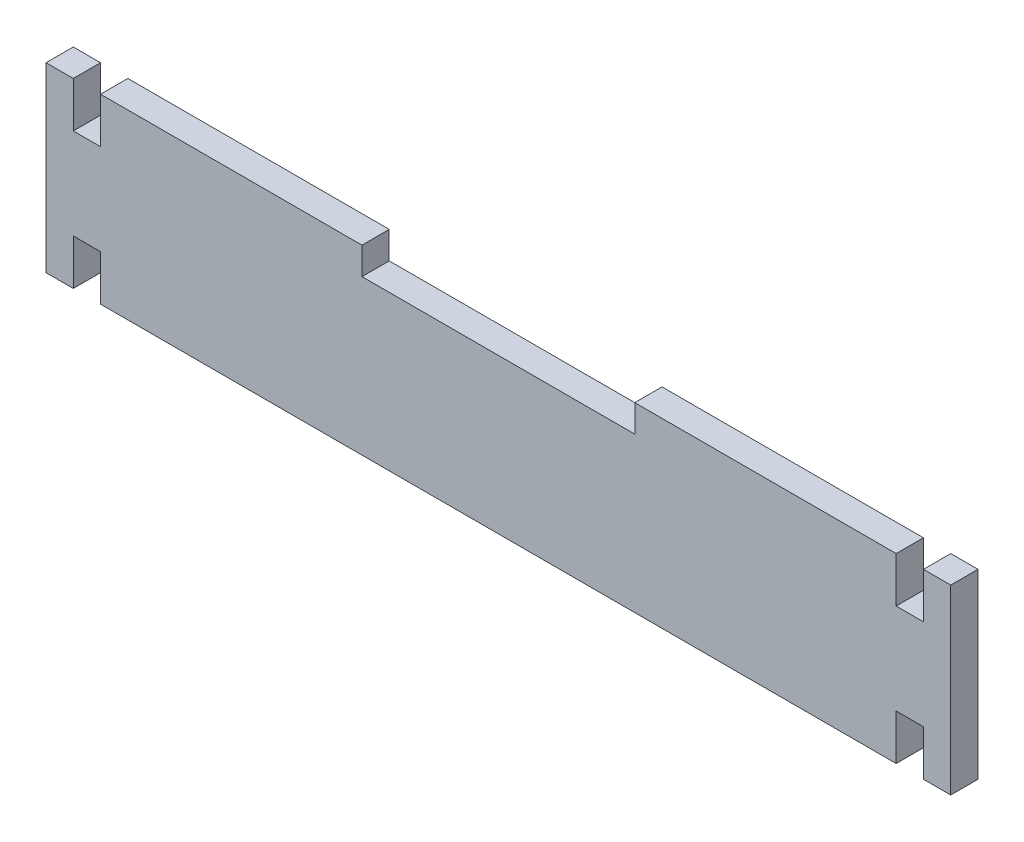
ISO-10303-21;
HEADER;
FILE_DESCRIPTION(('STEP AP214'),'2;1');
FILE_NAME('part.step','',(''),(''),'','','');
FILE_SCHEMA(('AUTOMOTIVE_DESIGN { 1 0 10303 214 1 1 1 1 }'));
ENDSEC;
DATA;
#1=APPLICATION_CONTEXT('core data for automotive mechanical design processes');
#2=APPLICATION_PROTOCOL_DEFINITION('international standard','automotive_design',2000,#1);
#3=PRODUCT_CONTEXT('',#1,'mechanical');
#4=PRODUCT('Part','Part','',(#3));
#5=PRODUCT_RELATED_PRODUCT_CATEGORY('part','',(#4));
#6=PRODUCT_DEFINITION_FORMATION('','',#4);
#7=PRODUCT_DEFINITION_CONTEXT('part definition',#1,'design');
#8=PRODUCT_DEFINITION('design','',#6,#7);
#9=PRODUCT_DEFINITION_SHAPE('','',#8);
#10=(LENGTH_UNIT() NAMED_UNIT(*) SI_UNIT(.MILLI.,.METRE.));
#11=(NAMED_UNIT(*) PLANE_ANGLE_UNIT() SI_UNIT($,.RADIAN.));
#12=(NAMED_UNIT(*) SI_UNIT($,.STERADIAN.) SOLID_ANGLE_UNIT());
#13=UNCERTAINTY_MEASURE_WITH_UNIT(LENGTH_MEASURE(1.E-05),#10,'distance_accuracy_value','');
#14=(GEOMETRIC_REPRESENTATION_CONTEXT(3) GLOBAL_UNCERTAINTY_ASSIGNED_CONTEXT((#13)) GLOBAL_UNIT_ASSIGNED_CONTEXT((#10,
#11,#12)) REPRESENTATION_CONTEXT('',''));
#15=CARTESIAN_POINT('',(0.,0.,0.));
#16=DIRECTION('',(0.,0.,1.));
#17=DIRECTION('',(1.,0.,0.));
#18=AXIS2_PLACEMENT_3D('',#15,#16,#17);
#19=CARTESIAN_POINT('',(0.,40.,6.));
#20=DIRECTION('',(0.,-1.,0.));
#21=DIRECTION('',(1.,0.,0.));
#22=AXIS2_PLACEMENT_3D('',#19,#20,#21);
#23=PLANE('',#22);
#24=DIRECTION('',(-1.,0.,0.));
#25=VECTOR('',#24,1.);
#26=CARTESIAN_POINT('',(0.,40.,6.));
#27=LINE('',#26,#25);
#28=CARTESIAN_POINT('',(-129.5,40.,6.));
#29=VERTEX_POINT('',#28);
#30=CARTESIAN_POINT('',(-187.,40.,6.));
#31=VERTEX_POINT('',#30);
#32=EDGE_CURVE('E406',#29,#31,#27,.T.);
#33=ORIENTED_EDGE('',*,*,#32,.F.);
#34=DIRECTION('',(0.,0.,1.));
#35=VECTOR('',#34,1.);
#36=CARTESIAN_POINT('',(-129.5,40.,0.));
#37=LINE('',#36,#35);
#38=CARTESIAN_POINT('',(-129.5,40.,0.));
#39=VERTEX_POINT('',#38);
#40=EDGE_CURVE('E242',#39,#29,#37,.T.);
#41=ORIENTED_EDGE('',*,*,#40,.F.);
#42=DIRECTION('',(-1.,0.,0.));
#43=VECTOR('',#42,1.);
#44=CARTESIAN_POINT('',(0.,40.,0.));
#45=LINE('',#44,#43);
#46=CARTESIAN_POINT('',(-187.,40.,0.));
#47=VERTEX_POINT('',#46);
#48=EDGE_CURVE('E228',#39,#47,#45,.T.);
#49=ORIENTED_EDGE('',*,*,#48,.T.);
#50=DIRECTION('',(0.,0.,1.));
#51=VECTOR('',#50,1.);
#52=CARTESIAN_POINT('',(-187.,40.,0.));
#53=LINE('',#52,#51);
#54=EDGE_CURVE('E385',#47,#31,#53,.T.);
#55=ORIENTED_EDGE('',*,*,#54,.T.);
#56=EDGE_LOOP('',(#33,#41,#49,#55));
#57=FACE_BOUND('',#56,.T.);
#58=ADVANCED_FACE('F44',(#57),#23,.F.);
#59=CARTESIAN_POINT('',(-12.,40.,0.));
#60=VERTEX_POINT('',#59);
#61=CARTESIAN_POINT('',(-69.5,40.,0.));
#62=VERTEX_POINT('',#61);
#63=EDGE_CURVE('E425',#60,#62,#45,.T.);
#64=ORIENTED_EDGE('',*,*,#63,.T.);
#65=DIRECTION('',(0.,0.,1.));
#66=VECTOR('',#65,1.);
#67=CARTESIAN_POINT('',(-69.5,40.,0.));
#68=LINE('',#67,#66);
#69=CARTESIAN_POINT('',(-69.5,40.,6.));
#70=VERTEX_POINT('',#69);
#71=EDGE_CURVE('E246',#62,#70,#68,.T.);
#72=ORIENTED_EDGE('',*,*,#71,.T.);
#73=CARTESIAN_POINT('',(-12.,40.,6.));
#74=VERTEX_POINT('',#73);
#75=EDGE_CURVE('E405',#74,#70,#27,.T.);
#76=ORIENTED_EDGE('',*,*,#75,.F.);
#77=DIRECTION('',(0.,0.,1.));
#78=VECTOR('',#77,1.);
#79=CARTESIAN_POINT('',(-12.,40.,0.));
#80=LINE('',#79,#78);
#81=EDGE_CURVE('E268',#60,#74,#80,.T.);
#82=ORIENTED_EDGE('',*,*,#81,.F.);
#83=EDGE_LOOP('',(#64,#72,#76,#82));
#84=FACE_BOUND('',#83,.T.);
#85=ADVANCED_FACE('F473',(#84),#23,.F.);
#86=CARTESIAN_POINT('',(0.,0.,6.));
#87=DIRECTION('',(0.,1.,0.));
#88=DIRECTION('',(-1.,0.,0.));
#89=AXIS2_PLACEMENT_3D('',#86,#87,#88);
#90=PLANE('',#89);
#91=DIRECTION('',(1.,0.,0.));
#92=VECTOR('',#91,1.);
#93=CARTESIAN_POINT('',(0.,0.,0.));
#94=LINE('',#93,#92);
#95=CARTESIAN_POINT('',(-199.,0.,0.));
#96=VERTEX_POINT('',#95);
#97=CARTESIAN_POINT('',(-193.,0.,0.));
#98=VERTEX_POINT('',#97);
#99=EDGE_CURVE('E399',#96,#98,#94,.T.);
#100=ORIENTED_EDGE('',*,*,#99,.T.);
#101=DIRECTION('',(0.,0.,1.));
#102=VECTOR('',#101,1.);
#103=CARTESIAN_POINT('',(-193.,0.,0.));
#104=LINE('',#103,#102);
#105=CARTESIAN_POINT('',(-193.,0.,6.));
#106=VERTEX_POINT('',#105);
#107=EDGE_CURVE('E263',#98,#106,#104,.T.);
#108=ORIENTED_EDGE('',*,*,#107,.T.);
#109=DIRECTION('',(1.,0.,0.));
#110=VECTOR('',#109,1.);
#111=CARTESIAN_POINT('',(0.,0.,6.));
#112=LINE('',#111,#110);
#113=CARTESIAN_POINT('',(-199.,0.,6.));
#114=VERTEX_POINT('',#113);
#115=EDGE_CURVE('E410',#114,#106,#112,.T.);
#116=ORIENTED_EDGE('',*,*,#115,.F.);
#117=DIRECTION('',(0.,0.,-1.));
#118=VECTOR('',#117,1.);
#119=CARTESIAN_POINT('',(-199.,0.,6.));
#120=LINE('',#119,#118);
#121=EDGE_CURVE('E436',#114,#96,#120,.T.);
#122=ORIENTED_EDGE('',*,*,#121,.T.);
#123=EDGE_LOOP('',(#100,#108,#116,#122));
#124=FACE_BOUND('',#123,.T.);
#125=ADVANCED_FACE('F453',(#124),#90,.F.);
#126=CARTESIAN_POINT('',(-187.,0.,6.));
#127=VERTEX_POINT('',#126);
#128=CARTESIAN_POINT('',(-12.,0.,6.));
#129=VERTEX_POINT('',#128);
#130=EDGE_CURVE('E415',#127,#129,#112,.T.);
#131=ORIENTED_EDGE('',*,*,#130,.F.);
#132=DIRECTION('',(0.,0.,1.));
#133=VECTOR('',#132,1.);
#134=CARTESIAN_POINT('',(-187.,0.,0.));
#135=LINE('',#134,#133);
#136=CARTESIAN_POINT('',(-187.,0.,0.));
#137=VERTEX_POINT('',#136);
#138=EDGE_CURVE('E282',#137,#127,#135,.T.);
#139=ORIENTED_EDGE('',*,*,#138,.F.);
#140=CARTESIAN_POINT('',(-12.,0.,0.));
#141=VERTEX_POINT('',#140);
#142=EDGE_CURVE('E432',#137,#141,#94,.T.);
#143=ORIENTED_EDGE('',*,*,#142,.T.);
#144=DIRECTION('',(0.,0.,1.));
#145=VECTOR('',#144,1.);
#146=CARTESIAN_POINT('',(-12.,0.,0.));
#147=LINE('',#146,#145);
#148=EDGE_CURVE('E337',#141,#129,#147,.T.);
#149=ORIENTED_EDGE('',*,*,#148,.T.);
#150=EDGE_LOOP('',(#131,#139,#143,#149));
#151=FACE_BOUND('',#150,.T.);
#152=ADVANCED_FACE('F510',(#151),#90,.F.);
#153=CARTESIAN_POINT('',(-193.,40.,6.));
#154=VERTEX_POINT('',#153);
#155=CARTESIAN_POINT('',(-199.,40.,6.));
#156=VERTEX_POINT('',#155);
#157=EDGE_CURVE('E398',#154,#156,#27,.T.);
#158=ORIENTED_EDGE('',*,*,#157,.F.);
#159=DIRECTION('',(0.,0.,1.));
#160=VECTOR('',#159,1.);
#161=CARTESIAN_POINT('',(-193.,40.,0.));
#162=LINE('',#161,#160);
#163=CARTESIAN_POINT('',(-193.,40.,0.));
#164=VERTEX_POINT('',#163);
#165=EDGE_CURVE('E381',#164,#154,#162,.T.);
#166=ORIENTED_EDGE('',*,*,#165,.F.);
#167=CARTESIAN_POINT('',(-199.,40.,0.));
#168=VERTEX_POINT('',#167);
#169=EDGE_CURVE('E419',#164,#168,#45,.T.);
#170=ORIENTED_EDGE('',*,*,#169,.T.);
#171=DIRECTION('',(0.,0.,-1.));
#172=VECTOR('',#171,1.);
#173=CARTESIAN_POINT('',(-199.,40.,6.));
#174=LINE('',#173,#172);
#175=EDGE_CURVE('E53',#156,#168,#174,.T.);
#176=ORIENTED_EDGE('',*,*,#175,.F.);
#177=EDGE_LOOP('',(#158,#166,#170,#176));
#178=FACE_BOUND('',#177,.T.);
#179=ADVANCED_FACE('F479',(#178),#23,.F.);
#180=CARTESIAN_POINT('',(0.,0.,6.));
#181=DIRECTION('',(-1.,0.,0.));
#182=DIRECTION('',(0.,0.,1.));
#183=AXIS2_PLACEMENT_3D('',#180,#181,#182);
#184=PLANE('',#183);
#185=DIRECTION('',(0.,1.,0.));
#186=VECTOR('',#185,1.);
#187=CARTESIAN_POINT('',(0.,0.,0.));
#188=LINE('',#187,#186);
#189=CARTESIAN_POINT('',(0.,0.,0.));
#190=VERTEX_POINT('',#189);
#191=CARTESIAN_POINT('',(0.,40.,0.));
#192=VERTEX_POINT('',#191);
#193=EDGE_CURVE('E384',#190,#192,#188,.T.);
#194=ORIENTED_EDGE('',*,*,#193,.T.);
#195=DIRECTION('',(0.,0.,-1.));
#196=VECTOR('',#195,1.);
#197=CARTESIAN_POINT('',(0.,40.,6.));
#198=LINE('',#197,#196);
#199=CARTESIAN_POINT('',(0.,40.,6.));
#200=VERTEX_POINT('',#199);
#201=EDGE_CURVE('E11',#200,#192,#198,.T.);
#202=ORIENTED_EDGE('',*,*,#201,.F.);
#203=DIRECTION('',(0.,1.,0.));
#204=VECTOR('',#203,1.);
#205=CARTESIAN_POINT('',(0.,0.,6.));
#206=LINE('',#205,#204);
#207=CARTESIAN_POINT('',(0.,0.,6.));
#208=VERTEX_POINT('',#207);
#209=EDGE_CURVE('E394',#208,#200,#206,.T.);
#210=ORIENTED_EDGE('',*,*,#209,.F.);
#211=DIRECTION('',(0.,0.,-1.));
#212=VECTOR('',#211,1.);
#213=CARTESIAN_POINT('',(0.,0.,6.));
#214=LINE('',#213,#212);
#215=EDGE_CURVE('E414',#208,#190,#214,.T.);
#216=ORIENTED_EDGE('',*,*,#215,.T.);
#217=EDGE_LOOP('',(#194,#202,#210,#216));
#218=FACE_BOUND('',#217,.T.);
#219=ADVANCED_FACE('F46',(#218),#184,.F.);
#220=CARTESIAN_POINT('',(-6.00000000000001,40.,0.));
#221=VERTEX_POINT('',#220);
#222=EDGE_CURVE('E420',#192,#221,#45,.T.);
#223=ORIENTED_EDGE('',*,*,#222,.T.);
#224=DIRECTION('',(0.,0.,1.));
#225=VECTOR('',#224,1.);
#226=CARTESIAN_POINT('',(-6.00000000000001,40.,0.));
#227=LINE('',#226,#225);
#228=CARTESIAN_POINT('',(-6.00000000000001,40.,6.));
#229=VERTEX_POINT('',#228);
#230=EDGE_CURVE('E315',#221,#229,#227,.T.);
#231=ORIENTED_EDGE('',*,*,#230,.T.);
#232=EDGE_CURVE('E400',#200,#229,#27,.T.);
#233=ORIENTED_EDGE('',*,*,#232,.F.);
#234=ORIENTED_EDGE('',*,*,#201,.T.);
#235=EDGE_LOOP('',(#223,#231,#233,#234));
#236=FACE_BOUND('',#235,.T.);
#237=ADVANCED_FACE('F493',(#236),#23,.F.);
#238=CARTESIAN_POINT('',(-199.,0.,6.));
#239=DIRECTION('',(1.,0.,0.));
#240=DIRECTION('',(0.,0.,-1.));
#241=AXIS2_PLACEMENT_3D('',#238,#239,#240);
#242=PLANE('',#241);
#243=DIRECTION('',(0.,-1.,0.));
#244=VECTOR('',#243,1.);
#245=CARTESIAN_POINT('',(-199.,0.,0.));
#246=LINE('',#245,#244);
#247=EDGE_CURVE('E424',#168,#96,#246,.T.);
#248=ORIENTED_EDGE('',*,*,#247,.T.);
#249=ORIENTED_EDGE('',*,*,#121,.F.);
#250=DIRECTION('',(0.,-1.,0.));
#251=VECTOR('',#250,1.);
#252=CARTESIAN_POINT('',(-199.,0.,6.));
#253=LINE('',#252,#251);
#254=EDGE_CURVE('E404',#156,#114,#253,.T.);
#255=ORIENTED_EDGE('',*,*,#254,.F.);
#256=ORIENTED_EDGE('',*,*,#175,.T.);
#257=EDGE_LOOP('',(#248,#249,#255,#256));
#258=FACE_BOUND('',#257,.T.);
#259=ADVANCED_FACE('F445',(#258),#242,.F.);
#260=CARTESIAN_POINT('',(-6.00000000000001,0.,6.));
#261=VERTEX_POINT('',#260);
#262=EDGE_CURVE('E409',#261,#208,#112,.T.);
#263=ORIENTED_EDGE('',*,*,#262,.F.);
#264=DIRECTION('',(0.,0.,1.));
#265=VECTOR('',#264,1.);
#266=CARTESIAN_POINT('',(-6.00000000000001,0.,0.));
#267=LINE('',#266,#265);
#268=CARTESIAN_POINT('',(-6.00000000000001,0.,0.));
#269=VERTEX_POINT('',#268);
#270=EDGE_CURVE('E352',#269,#261,#267,.T.);
#271=ORIENTED_EDGE('',*,*,#270,.F.);
#272=EDGE_CURVE('E428',#269,#190,#94,.T.);
#273=ORIENTED_EDGE('',*,*,#272,.T.);
#274=ORIENTED_EDGE('',*,*,#215,.F.);
#275=EDGE_LOOP('',(#263,#271,#273,#274));
#276=FACE_BOUND('',#275,.T.);
#277=ADVANCED_FACE('F506',(#276),#90,.F.);
#278=CARTESIAN_POINT('',(0.,0.,6.));
#279=DIRECTION('',(0.,0.,1.));
#280=DIRECTION('',(1.,0.,0.));
#281=AXIS2_PLACEMENT_3D('',#278,#279,#280);
#282=PLANE('',#281);
#283=DIRECTION('',(0.,-1.,0.));
#284=VECTOR('',#283,1.);
#285=CARTESIAN_POINT('',(-129.5,40.,6.));
#286=LINE('',#285,#284);
#287=CARTESIAN_POINT('',(-129.5,34.,6.));
#288=VERTEX_POINT('',#287);
#289=EDGE_CURVE('E212',#29,#288,#286,.T.);
#290=ORIENTED_EDGE('',*,*,#289,.F.);
#291=ORIENTED_EDGE('',*,*,#32,.T.);
#292=DIRECTION('',(0.,1.,0.));
#293=VECTOR('',#292,1.);
#294=CARTESIAN_POINT('',(-187.,40.,6.));
#295=LINE('',#294,#293);
#296=CARTESIAN_POINT('',(-187.,30.,6.));
#297=VERTEX_POINT('',#296);
#298=EDGE_CURVE('E363',#297,#31,#295,.T.);
#299=ORIENTED_EDGE('',*,*,#298,.F.);
#300=DIRECTION('',(1.,0.,0.));
#301=VECTOR('',#300,1.);
#302=CARTESIAN_POINT('',(-193.,30.,6.));
#303=LINE('',#302,#301);
#304=CARTESIAN_POINT('',(-193.,30.,6.));
#305=VERTEX_POINT('',#304);
#306=EDGE_CURVE('E374',#305,#297,#303,.T.);
#307=ORIENTED_EDGE('',*,*,#306,.F.);
#308=DIRECTION('',(0.,-1.,0.));
#309=VECTOR('',#308,1.);
#310=CARTESIAN_POINT('',(-193.,40.,6.));
#311=LINE('',#310,#309);
#312=EDGE_CURVE('E278',#154,#305,#311,.T.);
#313=ORIENTED_EDGE('',*,*,#312,.F.);
#314=ORIENTED_EDGE('',*,*,#157,.T.);
#315=ORIENTED_EDGE('',*,*,#254,.T.);
#316=ORIENTED_EDGE('',*,*,#115,.T.);
#317=DIRECTION('',(0.,-1.,0.));
#318=VECTOR('',#317,1.);
#319=CARTESIAN_POINT('',(-193.,10.,6.));
#320=LINE('',#319,#318);
#321=CARTESIAN_POINT('',(-193.,10.,6.));
#322=VERTEX_POINT('',#321);
#323=EDGE_CURVE('E264',#322,#106,#320,.T.);
#324=ORIENTED_EDGE('',*,*,#323,.F.);
#325=DIRECTION('',(-1.,0.,0.));
#326=VECTOR('',#325,1.);
#327=CARTESIAN_POINT('',(-193.,10.,6.));
#328=LINE('',#327,#326);
#329=CARTESIAN_POINT('',(-187.,10.,6.));
#330=VERTEX_POINT('',#329);
#331=EDGE_CURVE('E257',#330,#322,#328,.T.);
#332=ORIENTED_EDGE('',*,*,#331,.F.);
#333=DIRECTION('',(0.,1.,0.));
#334=VECTOR('',#333,1.);
#335=CARTESIAN_POINT('',(-187.,10.,6.));
#336=LINE('',#335,#334);
#337=EDGE_CURVE('E267',#127,#330,#336,.T.);
#338=ORIENTED_EDGE('',*,*,#337,.F.);
#339=ORIENTED_EDGE('',*,*,#130,.T.);
#340=DIRECTION('',(0.,-1.,0.));
#341=VECTOR('',#340,1.);
#342=CARTESIAN_POINT('',(-12.,10.,6.));
#343=LINE('',#342,#341);
#344=CARTESIAN_POINT('',(-12.,10.,6.));
#345=VERTEX_POINT('',#344);
#346=EDGE_CURVE('E245',#345,#129,#343,.T.);
#347=ORIENTED_EDGE('',*,*,#346,.F.);
#348=DIRECTION('',(-1.,0.,0.));
#349=VECTOR('',#348,1.);
#350=CARTESIAN_POINT('',(-12.,10.,6.));
#351=LINE('',#350,#349);
#352=CARTESIAN_POINT('',(-6.00000000000001,10.,6.));
#353=VERTEX_POINT('',#352);
#354=EDGE_CURVE('E329',#353,#345,#351,.T.);
#355=ORIENTED_EDGE('',*,*,#354,.F.);
#356=DIRECTION('',(0.,1.,0.));
#357=VECTOR('',#356,1.);
#358=CARTESIAN_POINT('',(-6.00000000000001,10.,6.));
#359=LINE('',#358,#357);
#360=EDGE_CURVE('E340',#261,#353,#359,.T.);
#361=ORIENTED_EDGE('',*,*,#360,.F.);
#362=ORIENTED_EDGE('',*,*,#262,.T.);
#363=ORIENTED_EDGE('',*,*,#209,.T.);
#364=ORIENTED_EDGE('',*,*,#232,.T.);
#365=DIRECTION('',(0.,1.,0.));
#366=VECTOR('',#365,1.);
#367=CARTESIAN_POINT('',(-6.00000000000001,40.,6.));
#368=LINE('',#367,#366);
#369=CARTESIAN_POINT('',(-6.00000000000001,30.,6.));
#370=VERTEX_POINT('',#369);
#371=EDGE_CURVE('E293',#370,#229,#368,.T.);
#372=ORIENTED_EDGE('',*,*,#371,.F.);
#373=DIRECTION('',(1.,0.,0.));
#374=VECTOR('',#373,1.);
#375=CARTESIAN_POINT('',(-12.,30.,6.));
#376=LINE('',#375,#374);
#377=CARTESIAN_POINT('',(-12.,30.,6.));
#378=VERTEX_POINT('',#377);
#379=EDGE_CURVE('E306',#378,#370,#376,.T.);
#380=ORIENTED_EDGE('',*,*,#379,.F.);
#381=DIRECTION('',(0.,-1.,0.));
#382=VECTOR('',#381,1.);
#383=CARTESIAN_POINT('',(-12.,40.,6.));
#384=LINE('',#383,#382);
#385=EDGE_CURVE('E302',#74,#378,#384,.T.);
#386=ORIENTED_EDGE('',*,*,#385,.F.);
#387=ORIENTED_EDGE('',*,*,#75,.T.);
#388=DIRECTION('',(0.,1.,0.));
#389=VECTOR('',#388,1.);
#390=CARTESIAN_POINT('',(-69.5,40.,6.));
#391=LINE('',#390,#389);
#392=CARTESIAN_POINT('',(-69.5,34.,6.));
#393=VERTEX_POINT('',#392);
#394=EDGE_CURVE('E230',#393,#70,#391,.T.);
#395=ORIENTED_EDGE('',*,*,#394,.F.);
#396=DIRECTION('',(1.,0.,0.));
#397=VECTOR('',#396,1.);
#398=CARTESIAN_POINT('',(-129.5,34.,6.));
#399=LINE('',#398,#397);
#400=EDGE_CURVE('E233',#288,#393,#399,.T.);
#401=ORIENTED_EDGE('',*,*,#400,.F.);
#402=EDGE_LOOP('',(#290,#291,#299,#307,#313,#314,#315,#316,#324,#332,#338,#339,#347,#355,#361,
#362,#363,#364,#372,#380,#386,#387,#395,#401));
#403=FACE_BOUND('',#402,.T.);
#404=ADVANCED_FACE('F457',(#403),#282,.T.);
#405=CARTESIAN_POINT('',(0.,0.,0.));
#406=DIRECTION('',(0.,0.,1.));
#407=DIRECTION('',(1.,0.,0.));
#408=AXIS2_PLACEMENT_3D('',#405,#406,#407);
#409=PLANE('',#408);
#410=ORIENTED_EDGE('',*,*,#48,.F.);
#411=DIRECTION('',(0.,-1.,0.));
#412=VECTOR('',#411,1.);
#413=CARTESIAN_POINT('',(-129.5,40.,0.));
#414=LINE('',#413,#412);
#415=CARTESIAN_POINT('',(-129.5,34.,0.));
#416=VERTEX_POINT('',#415);
#417=EDGE_CURVE('E209',#39,#416,#414,.T.);
#418=ORIENTED_EDGE('',*,*,#417,.T.);
#419=DIRECTION('',(1.,0.,0.));
#420=VECTOR('',#419,1.);
#421=CARTESIAN_POINT('',(-129.5,34.,0.));
#422=LINE('',#421,#420);
#423=CARTESIAN_POINT('',(-69.5,34.,0.));
#424=VERTEX_POINT('',#423);
#425=EDGE_CURVE('E220',#416,#424,#422,.T.);
#426=ORIENTED_EDGE('',*,*,#425,.T.);
#427=DIRECTION('',(0.,1.,0.));
#428=VECTOR('',#427,1.);
#429=CARTESIAN_POINT('',(-69.5,40.,0.));
#430=LINE('',#429,#428);
#431=EDGE_CURVE('E60',#424,#62,#430,.T.);
#432=ORIENTED_EDGE('',*,*,#431,.T.);
#433=ORIENTED_EDGE('',*,*,#63,.F.);
#434=DIRECTION('',(0.,-1.,0.));
#435=VECTOR('',#434,1.);
#436=CARTESIAN_POINT('',(-12.,40.,0.));
#437=LINE('',#436,#435);
#438=CARTESIAN_POINT('',(-12.,30.,0.));
#439=VERTEX_POINT('',#438);
#440=EDGE_CURVE('E288',#60,#439,#437,.T.);
#441=ORIENTED_EDGE('',*,*,#440,.T.);
#442=DIRECTION('',(1.,0.,0.));
#443=VECTOR('',#442,1.);
#444=CARTESIAN_POINT('',(-12.,30.,0.));
#445=LINE('',#444,#443);
#446=CARTESIAN_POINT('',(-6.00000000000001,30.,0.));
#447=VERTEX_POINT('',#446);
#448=EDGE_CURVE('E292',#439,#447,#445,.T.);
#449=ORIENTED_EDGE('',*,*,#448,.T.);
#450=DIRECTION('',(0.,1.,0.));
#451=VECTOR('',#450,1.);
#452=CARTESIAN_POINT('',(-6.00000000000001,40.,0.));
#453=LINE('',#452,#451);
#454=EDGE_CURVE('E297',#447,#221,#453,.T.);
#455=ORIENTED_EDGE('',*,*,#454,.T.);
#456=ORIENTED_EDGE('',*,*,#222,.F.);
#457=ORIENTED_EDGE('',*,*,#193,.F.);
#458=ORIENTED_EDGE('',*,*,#272,.F.);
#459=DIRECTION('',(0.,1.,0.));
#460=VECTOR('',#459,1.);
#461=CARTESIAN_POINT('',(-6.00000000000001,10.,0.));
#462=LINE('',#461,#460);
#463=CARTESIAN_POINT('',(-6.00000000000001,10.,0.));
#464=VERTEX_POINT('',#463);
#465=EDGE_CURVE('E328',#269,#464,#462,.T.);
#466=ORIENTED_EDGE('',*,*,#465,.T.);
#467=DIRECTION('',(-1.,0.,0.));
#468=VECTOR('',#467,1.);
#469=CARTESIAN_POINT('',(-12.,10.,0.));
#470=LINE('',#469,#468);
#471=CARTESIAN_POINT('',(-12.,10.,0.));
#472=VERTEX_POINT('',#471);
#473=EDGE_CURVE('E333',#464,#472,#470,.T.);
#474=ORIENTED_EDGE('',*,*,#473,.T.);
#475=DIRECTION('',(0.,-1.,0.));
#476=VECTOR('',#475,1.);
#477=CARTESIAN_POINT('',(-12.,10.,0.));
#478=LINE('',#477,#476);
#479=EDGE_CURVE('E324',#472,#141,#478,.T.);
#480=ORIENTED_EDGE('',*,*,#479,.T.);
#481=ORIENTED_EDGE('',*,*,#142,.F.);
#482=DIRECTION('',(0.,1.,0.));
#483=VECTOR('',#482,1.);
#484=CARTESIAN_POINT('',(-187.,10.,0.));
#485=LINE('',#484,#483);
#486=CARTESIAN_POINT('',(-187.,10.,0.));
#487=VERTEX_POINT('',#486);
#488=EDGE_CURVE('E256',#137,#487,#485,.T.);
#489=ORIENTED_EDGE('',*,*,#488,.T.);
#490=DIRECTION('',(-1.,0.,0.));
#491=VECTOR('',#490,1.);
#492=CARTESIAN_POINT('',(-193.,10.,0.));
#493=LINE('',#492,#491);
#494=CARTESIAN_POINT('',(-193.,10.,0.));
#495=VERTEX_POINT('',#494);
#496=EDGE_CURVE('E68',#487,#495,#493,.T.);
#497=ORIENTED_EDGE('',*,*,#496,.T.);
#498=DIRECTION('',(0.,-1.,0.));
#499=VECTOR('',#498,1.);
#500=CARTESIAN_POINT('',(-193.,10.,0.));
#501=LINE('',#500,#499);
#502=EDGE_CURVE('E252',#495,#98,#501,.T.);
#503=ORIENTED_EDGE('',*,*,#502,.T.);
#504=ORIENTED_EDGE('',*,*,#99,.F.);
#505=ORIENTED_EDGE('',*,*,#247,.F.);
#506=ORIENTED_EDGE('',*,*,#169,.F.);
#507=DIRECTION('',(0.,-1.,0.));
#508=VECTOR('',#507,1.);
#509=CARTESIAN_POINT('',(-193.,40.,0.));
#510=LINE('',#509,#508);
#511=CARTESIAN_POINT('',(-193.,30.,0.));
#512=VERTEX_POINT('',#511);
#513=EDGE_CURVE('E358',#164,#512,#510,.T.);
#514=ORIENTED_EDGE('',*,*,#513,.T.);
#515=DIRECTION('',(1.,0.,0.));
#516=VECTOR('',#515,1.);
#517=CARTESIAN_POINT('',(-193.,30.,0.));
#518=LINE('',#517,#516);
#519=CARTESIAN_POINT('',(-187.,30.,0.));
#520=VERTEX_POINT('',#519);
#521=EDGE_CURVE('E362',#512,#520,#518,.T.);
#522=ORIENTED_EDGE('',*,*,#521,.T.);
#523=DIRECTION('',(0.,1.,0.));
#524=VECTOR('',#523,1.);
#525=CARTESIAN_POINT('',(-187.,40.,0.));
#526=LINE('',#525,#524);
#527=EDGE_CURVE('E367',#520,#47,#526,.T.);
#528=ORIENTED_EDGE('',*,*,#527,.T.);
#529=EDGE_LOOP('',(#410,#418,#426,#432,#433,#441,#449,#455,#456,#457,#458,#466,#474,#480,#481,
#489,#497,#503,#504,#505,#506,#514,#522,#528));
#530=FACE_BOUND('',#529,.T.);
#531=ADVANCED_FACE('F226',(#530),#409,.F.);
#532=CARTESIAN_POINT('',(-193.,40.,0.));
#533=DIRECTION('',(-1.,0.,0.));
#534=DIRECTION('',(0.,0.,1.));
#535=AXIS2_PLACEMENT_3D('',#532,#533,#534);
#536=PLANE('',#535);
#537=ORIENTED_EDGE('',*,*,#312,.T.);
#538=DIRECTION('',(0.,0.,1.));
#539=VECTOR('',#538,1.);
#540=CARTESIAN_POINT('',(-193.,30.,0.));
#541=LINE('',#540,#539);
#542=EDGE_CURVE('E370',#512,#305,#541,.T.);
#543=ORIENTED_EDGE('',*,*,#542,.F.);
#544=ORIENTED_EDGE('',*,*,#513,.F.);
#545=ORIENTED_EDGE('',*,*,#165,.T.);
#546=EDGE_LOOP('',(#537,#543,#544,#545));
#547=FACE_BOUND('',#546,.T.);
#548=ADVANCED_FACE('F481',(#547),#536,.F.);
#549=CARTESIAN_POINT('',(-187.,40.,0.));
#550=DIRECTION('',(1.,0.,0.));
#551=DIRECTION('',(0.,0.,-1.));
#552=AXIS2_PLACEMENT_3D('',#549,#550,#551);
#553=PLANE('',#552);
#554=ORIENTED_EDGE('',*,*,#298,.T.);
#555=ORIENTED_EDGE('',*,*,#54,.F.);
#556=ORIENTED_EDGE('',*,*,#527,.F.);
#557=DIRECTION('',(0.,0.,1.));
#558=VECTOR('',#557,1.);
#559=CARTESIAN_POINT('',(-187.,30.,0.));
#560=LINE('',#559,#558);
#561=EDGE_CURVE('E389',#520,#297,#560,.T.);
#562=ORIENTED_EDGE('',*,*,#561,.T.);
#563=EDGE_LOOP('',(#554,#555,#556,#562));
#564=FACE_BOUND('',#563,.T.);
#565=ADVANCED_FACE('F488',(#564),#553,.F.);
#566=CARTESIAN_POINT('',(-193.,30.,0.));
#567=DIRECTION('',(0.,-1.,0.));
#568=DIRECTION('',(0.,0.,-1.));
#569=AXIS2_PLACEMENT_3D('',#566,#567,#568);
#570=PLANE('',#569);
#571=ORIENTED_EDGE('',*,*,#306,.T.);
#572=ORIENTED_EDGE('',*,*,#561,.F.);
#573=ORIENTED_EDGE('',*,*,#521,.F.);
#574=ORIENTED_EDGE('',*,*,#542,.T.);
#575=EDGE_LOOP('',(#571,#572,#573,#574));
#576=FACE_BOUND('',#575,.T.);
#577=ADVANCED_FACE('F485',(#576),#570,.F.);
#578=CARTESIAN_POINT('',(-12.,10.,0.));
#579=DIRECTION('',(-1.,0.,0.));
#580=DIRECTION('',(0.,0.,1.));
#581=AXIS2_PLACEMENT_3D('',#578,#579,#580);
#582=PLANE('',#581);
#583=ORIENTED_EDGE('',*,*,#346,.T.);
#584=ORIENTED_EDGE('',*,*,#148,.F.);
#585=ORIENTED_EDGE('',*,*,#479,.F.);
#586=DIRECTION('',(0.,0.,1.));
#587=VECTOR('',#586,1.);
#588=CARTESIAN_POINT('',(-12.,10.,0.));
#589=LINE('',#588,#587);
#590=EDGE_CURVE('E307',#472,#345,#589,.T.);
#591=ORIENTED_EDGE('',*,*,#590,.T.);
#592=EDGE_LOOP('',(#583,#584,#585,#591));
#593=FACE_BOUND('',#592,.T.);
#594=ADVANCED_FACE('F545',(#593),#582,.F.);
#595=CARTESIAN_POINT('',(-12.,10.,0.));
#596=DIRECTION('',(0.,1.,0.));
#597=DIRECTION('',(0.,0.,1.));
#598=AXIS2_PLACEMENT_3D('',#595,#596,#597);
#599=PLANE('',#598);
#600=ORIENTED_EDGE('',*,*,#354,.T.);
#601=ORIENTED_EDGE('',*,*,#590,.F.);
#602=ORIENTED_EDGE('',*,*,#473,.F.);
#603=DIRECTION('',(0.,0.,1.));
#604=VECTOR('',#603,1.);
#605=CARTESIAN_POINT('',(-6.00000000000001,10.,0.));
#606=LINE('',#605,#604);
#607=EDGE_CURVE('E349',#464,#353,#606,.T.);
#608=ORIENTED_EDGE('',*,*,#607,.T.);
#609=EDGE_LOOP('',(#600,#601,#602,#608));
#610=FACE_BOUND('',#609,.T.);
#611=ADVANCED_FACE('F548',(#610),#599,.F.);
#612=CARTESIAN_POINT('',(-6.00000000000001,10.,0.));
#613=DIRECTION('',(1.,0.,0.));
#614=DIRECTION('',(0.,0.,-1.));
#615=AXIS2_PLACEMENT_3D('',#612,#613,#614);
#616=PLANE('',#615);
#617=ORIENTED_EDGE('',*,*,#360,.T.);
#618=ORIENTED_EDGE('',*,*,#607,.F.);
#619=ORIENTED_EDGE('',*,*,#465,.F.);
#620=ORIENTED_EDGE('',*,*,#270,.T.);
#621=EDGE_LOOP('',(#617,#618,#619,#620));
#622=FACE_BOUND('',#621,.T.);
#623=ADVANCED_FACE('F550',(#622),#616,.F.);
#624=CARTESIAN_POINT('',(-12.,40.,0.));
#625=DIRECTION('',(-1.,0.,0.));
#626=DIRECTION('',(0.,0.,1.));
#627=AXIS2_PLACEMENT_3D('',#624,#625,#626);
#628=PLANE('',#627);
#629=ORIENTED_EDGE('',*,*,#385,.T.);
#630=DIRECTION('',(0.,0.,1.));
#631=VECTOR('',#630,1.);
#632=CARTESIAN_POINT('',(-12.,30.,0.));
#633=LINE('',#632,#631);
#634=EDGE_CURVE('E301',#439,#378,#633,.T.);
#635=ORIENTED_EDGE('',*,*,#634,.F.);
#636=ORIENTED_EDGE('',*,*,#440,.F.);
#637=ORIENTED_EDGE('',*,*,#81,.T.);
#638=EDGE_LOOP('',(#629,#635,#636,#637));
#639=FACE_BOUND('',#638,.T.);
#640=ADVANCED_FACE('F552',(#639),#628,.F.);
#641=CARTESIAN_POINT('',(-6.00000000000001,40.,0.));
#642=DIRECTION('',(1.,0.,0.));
#643=DIRECTION('',(0.,0.,-1.));
#644=AXIS2_PLACEMENT_3D('',#641,#642,#643);
#645=PLANE('',#644);
#646=ORIENTED_EDGE('',*,*,#371,.T.);
#647=ORIENTED_EDGE('',*,*,#230,.F.);
#648=ORIENTED_EDGE('',*,*,#454,.F.);
#649=DIRECTION('',(0.,0.,1.));
#650=VECTOR('',#649,1.);
#651=CARTESIAN_POINT('',(-6.00000000000001,30.,0.));
#652=LINE('',#651,#650);
#653=EDGE_CURVE('E319',#447,#370,#652,.T.);
#654=ORIENTED_EDGE('',*,*,#653,.T.);
#655=EDGE_LOOP('',(#646,#647,#648,#654));
#656=FACE_BOUND('',#655,.T.);
#657=ADVANCED_FACE('F558',(#656),#645,.F.);
#658=CARTESIAN_POINT('',(-12.,30.,0.));
#659=DIRECTION('',(0.,-1.,0.));
#660=DIRECTION('',(0.,0.,-1.));
#661=AXIS2_PLACEMENT_3D('',#658,#659,#660);
#662=PLANE('',#661);
#663=ORIENTED_EDGE('',*,*,#379,.T.);
#664=ORIENTED_EDGE('',*,*,#653,.F.);
#665=ORIENTED_EDGE('',*,*,#448,.F.);
#666=ORIENTED_EDGE('',*,*,#634,.T.);
#667=EDGE_LOOP('',(#663,#664,#665,#666));
#668=FACE_BOUND('',#667,.T.);
#669=ADVANCED_FACE('F638',(#668),#662,.F.);
#670=CARTESIAN_POINT('',(-193.,10.,0.));
#671=DIRECTION('',(-1.,0.,0.));
#672=DIRECTION('',(0.,0.,1.));
#673=AXIS2_PLACEMENT_3D('',#670,#671,#672);
#674=PLANE('',#673);
#675=ORIENTED_EDGE('',*,*,#323,.T.);
#676=ORIENTED_EDGE('',*,*,#107,.F.);
#677=ORIENTED_EDGE('',*,*,#502,.F.);
#678=DIRECTION('',(0.,0.,1.));
#679=VECTOR('',#678,1.);
#680=CARTESIAN_POINT('',(-193.,10.,0.));
#681=LINE('',#680,#679);
#682=EDGE_CURVE('E275',#495,#322,#681,.T.);
#683=ORIENTED_EDGE('',*,*,#682,.T.);
#684=EDGE_LOOP('',(#675,#676,#677,#683));
#685=FACE_BOUND('',#684,.T.);
#686=ADVANCED_FACE('F629',(#685),#674,.F.);
#687=CARTESIAN_POINT('',(-193.,10.,0.));
#688=DIRECTION('',(0.,1.,0.));
#689=DIRECTION('',(0.,0.,1.));
#690=AXIS2_PLACEMENT_3D('',#687,#688,#689);
#691=PLANE('',#690);
#692=ORIENTED_EDGE('',*,*,#331,.T.);
#693=ORIENTED_EDGE('',*,*,#682,.F.);
#694=ORIENTED_EDGE('',*,*,#496,.F.);
#695=DIRECTION('',(0.,0.,1.));
#696=VECTOR('',#695,1.);
#697=CARTESIAN_POINT('',(-187.,10.,0.));
#698=LINE('',#697,#696);
#699=EDGE_CURVE('E279',#487,#330,#698,.T.);
#700=ORIENTED_EDGE('',*,*,#699,.T.);
#701=EDGE_LOOP('',(#692,#693,#694,#700));
#702=FACE_BOUND('',#701,.T.);
#703=ADVANCED_FACE('F620',(#702),#691,.F.);
#704=CARTESIAN_POINT('',(-187.,10.,0.));
#705=DIRECTION('',(1.,0.,0.));
#706=DIRECTION('',(0.,0.,-1.));
#707=AXIS2_PLACEMENT_3D('',#704,#705,#706);
#708=PLANE('',#707);
#709=ORIENTED_EDGE('',*,*,#337,.T.);
#710=ORIENTED_EDGE('',*,*,#699,.F.);
#711=ORIENTED_EDGE('',*,*,#488,.F.);
#712=ORIENTED_EDGE('',*,*,#138,.T.);
#713=EDGE_LOOP('',(#709,#710,#711,#712));
#714=FACE_BOUND('',#713,.T.);
#715=ADVANCED_FACE('F584',(#714),#708,.F.);
#716=CARTESIAN_POINT('',(-129.5,40.,0.));
#717=DIRECTION('',(-1.,0.,0.));
#718=DIRECTION('',(0.,0.,1.));
#719=AXIS2_PLACEMENT_3D('',#716,#717,#718);
#720=PLANE('',#719);
#721=ORIENTED_EDGE('',*,*,#289,.T.);
#722=DIRECTION('',(0.,0.,1.));
#723=VECTOR('',#722,1.);
#724=CARTESIAN_POINT('',(-129.5,34.,0.));
#725=LINE('',#724,#723);
#726=EDGE_CURVE('E205',#416,#288,#725,.T.);
#727=ORIENTED_EDGE('',*,*,#726,.F.);
#728=ORIENTED_EDGE('',*,*,#417,.F.);
#729=ORIENTED_EDGE('',*,*,#40,.T.);
#730=EDGE_LOOP('',(#721,#727,#728,#729));
#731=FACE_BOUND('',#730,.T.);
#732=ADVANCED_FACE('F207',(#731),#720,.F.);
#733=CARTESIAN_POINT('',(-69.5,40.,0.));
#734=DIRECTION('',(1.,0.,0.));
#735=DIRECTION('',(0.,0.,-1.));
#736=AXIS2_PLACEMENT_3D('',#733,#734,#735);
#737=PLANE('',#736);
#738=ORIENTED_EDGE('',*,*,#394,.T.);
#739=ORIENTED_EDGE('',*,*,#71,.F.);
#740=ORIENTED_EDGE('',*,*,#431,.F.);
#741=DIRECTION('',(0.,0.,1.));
#742=VECTOR('',#741,1.);
#743=CARTESIAN_POINT('',(-69.5,34.,0.));
#744=LINE('',#743,#742);
#745=EDGE_CURVE('E217',#424,#393,#744,.T.);
#746=ORIENTED_EDGE('',*,*,#745,.T.);
#747=EDGE_LOOP('',(#738,#739,#740,#746));
#748=FACE_BOUND('',#747,.T.);
#749=ADVANCED_FACE('F475',(#748),#737,.F.);
#750=CARTESIAN_POINT('',(-129.5,34.,0.));
#751=DIRECTION('',(0.,-1.,0.));
#752=DIRECTION('',(1.,0.,0.));
#753=AXIS2_PLACEMENT_3D('',#750,#751,#752);
#754=PLANE('',#753);
#755=ORIENTED_EDGE('',*,*,#400,.T.);
#756=ORIENTED_EDGE('',*,*,#745,.F.);
#757=ORIENTED_EDGE('',*,*,#425,.F.);
#758=ORIENTED_EDGE('',*,*,#726,.T.);
#759=EDGE_LOOP('',(#755,#756,#757,#758));
#760=FACE_BOUND('',#759,.T.);
#761=ADVANCED_FACE('F221',(#760),#754,.F.);
#762=CLOSED_SHELL('',(#58,#85,#125,#152,#179,#219,#237,#259,#277,#404,#531,#548,#565,#577,#594,
#611,#623,#640,#657,#669,#686,#703,#715,#732,#749,#761));
#763=MANIFOLD_SOLID_BREP('B2',#762);
#764=ADVANCED_BREP_SHAPE_REPRESENTATION('',(#18,#763),#14);
#765=SHAPE_DEFINITION_REPRESENTATION(#9,#764);
ENDSEC;
END-ISO-10303-21;
